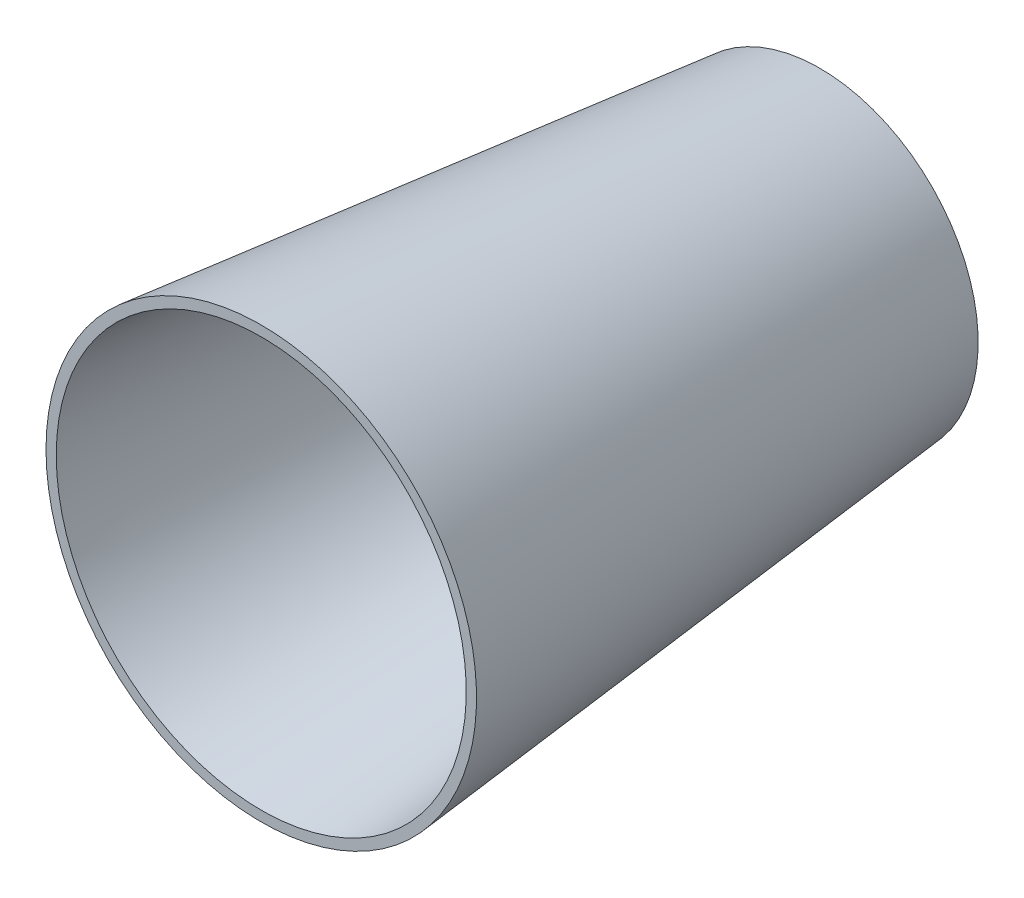
ISO-10303-21;
HEADER;
FILE_DESCRIPTION(('STEP AP214'),'2;1');
FILE_NAME('part.step','',(''),(''),'','','');
FILE_SCHEMA(('AUTOMOTIVE_DESIGN { 1 0 10303 214 1 1 1 1 }'));
ENDSEC;
DATA;
#1=APPLICATION_CONTEXT('core data for automotive mechanical design processes');
#2=APPLICATION_PROTOCOL_DEFINITION('international standard','automotive_design',2000,#1);
#3=PRODUCT_CONTEXT('',#1,'mechanical');
#4=PRODUCT('Part','Part','',(#3));
#5=PRODUCT_RELATED_PRODUCT_CATEGORY('part','',(#4));
#6=PRODUCT_DEFINITION_FORMATION('','',#4);
#7=PRODUCT_DEFINITION_CONTEXT('part definition',#1,'design');
#8=PRODUCT_DEFINITION('design','',#6,#7);
#9=PRODUCT_DEFINITION_SHAPE('','',#8);
#10=(LENGTH_UNIT() NAMED_UNIT(*) SI_UNIT(.MILLI.,.METRE.));
#11=(NAMED_UNIT(*) PLANE_ANGLE_UNIT() SI_UNIT($,.RADIAN.));
#12=(NAMED_UNIT(*) SI_UNIT($,.STERADIAN.) SOLID_ANGLE_UNIT());
#13=UNCERTAINTY_MEASURE_WITH_UNIT(LENGTH_MEASURE(1.E-05),#10,'distance_accuracy_value','');
#14=(GEOMETRIC_REPRESENTATION_CONTEXT(3) GLOBAL_UNCERTAINTY_ASSIGNED_CONTEXT((#13)) GLOBAL_UNIT_ASSIGNED_CONTEXT((#10,
#11,#12)) REPRESENTATION_CONTEXT('',''));
#15=CARTESIAN_POINT('',(0.,0.,0.));
#16=DIRECTION('',(0.,0.,1.));
#17=DIRECTION('',(1.,0.,0.));
#18=AXIS2_PLACEMENT_3D('',#15,#16,#17);
#19=CARTESIAN_POINT('',(0.,481.335355706457,34.121689050697));
#20=DIRECTION('',(0.,0.,1.));
#21=DIRECTION('',(1.,0.,0.));
#22=AXIS2_PLACEMENT_3D('',#19,#20,#21);
#23=PLANE('',#22);
#24=CARTESIAN_POINT('',(0.,481.335355706457,34.121689050697));
#25=DIRECTION('',(0.,0.,-1.));
#26=DIRECTION('',(-1.,0.,0.));
#27=AXIS2_PLACEMENT_3D('',#24,#25,#26);
#28=CIRCLE('',#27,30.);
#29=CARTESIAN_POINT('',(-30.,481.335355706457,34.121689050697));
#30=VERTEX_POINT('',#29);
#31=EDGE_CURVE('E64',#30,#30,#28,.T.);
#32=ORIENTED_EDGE('',*,*,#31,.T.);
#33=EDGE_LOOP('',(#32));
#34=FACE_BOUND('',#33,.T.);
#35=CARTESIAN_POINT('',(0.,481.335355706457,34.121689050697));
#36=DIRECTION('',(0.,0.,-1.));
#37=DIRECTION('',(-1.,0.,0.));
#38=AXIS2_PLACEMENT_3D('',#35,#36,#37);
#39=CIRCLE('',#38,31.5);
#40=CARTESIAN_POINT('',(-31.5,481.335355706457,34.121689050697));
#41=VERTEX_POINT('',#40);
#42=EDGE_CURVE('E54',#41,#41,#39,.T.);
#43=ORIENTED_EDGE('',*,*,#42,.F.);
#44=EDGE_LOOP('',(#43));
#45=FACE_BOUND('',#44,.T.);
#46=ADVANCED_FACE('F41',(#34,#45),#23,.T.);
#47=CARTESIAN_POINT('',(0.,481.335355706457,-46.1217266668383));
#48=DIRECTION('',(0.,0.,-1.));
#49=DIRECTION('',(-1.,0.,0.));
#50=AXIS2_PLACEMENT_3D('',#47,#48,#49);
#51=CONICAL_SURFACE('',#50,0.,0.108853111800816);
#52=CARTESIAN_POINT('',(0.,481.335355706457,-46.130710996536));
#53=DIRECTION('',(0.,0.,-1.));
#54=DIRECTION('',(-1.,0.,0.));
#55=AXIS2_PLACEMENT_3D('',#52,#53,#54);
#56=CIRCLE('',#55,0.000981853305108327);
#57=CARTESIAN_POINT('',(-0.000981853305107948,481.335355706457,-46.130710996536));
#58=VERTEX_POINT('',#57);
#59=EDGE_CURVE('E44',#58,#58,#56,.T.);
#60=CARTESIAN_POINT('',(0.,481.335355706457,-47.6217266668383));
#61=DIRECTION('',(0.,0.,-1.));
#62=DIRECTION('',(-1.,0.,0.));
#63=AXIS2_PLACEMENT_3D('',#60,#61,#62);
#64=CIRCLE('',#63,0.163927639258654);
#65=CARTESIAN_POINT('',(-0.163927639258654,481.335355706457,-47.6217266668383));
#66=VERTEX_POINT('',#65);
#67=EDGE_CURVE('E10',#66,#66,#64,.T.);
#68=CARTESIAN_POINT('',(-0.000981853305107948,481.335355706457,-46.130710996536));
#69=CARTESIAN_POINT('',(-0.00267920524212405,481.335355706457,-46.1462424097683));
#70=CARTESIAN_POINT('',(-0.00437655717914015,481.335355706457,-46.1617738230006));
#71=CARTESIAN_POINT('',(-0.00777126105317236,481.335355706457,-46.1928366494653));
#72=CARTESIAN_POINT('',(-0.00946861299018846,481.335355706457,-46.2083680626976));
#73=CARTESIAN_POINT('',(-0.0128633168642207,481.335355706457,-46.2394308891622));
#74=CARTESIAN_POINT('',(-0.0145606688012368,481.335355706457,-46.2549623023945));
#75=CARTESIAN_POINT('',(-0.017955372675269,481.335355706457,-46.2860251288592));
#76=CARTESIAN_POINT('',(-0.0196527246122851,481.335355706457,-46.3015565420915));
#77=CARTESIAN_POINT('',(-0.0230474284863173,481.335355706457,-46.3326193685561));
#78=CARTESIAN_POINT('',(-0.0247447804233334,481.335355706457,-46.3481507817884));
#79=CARTESIAN_POINT('',(-0.0281394842973656,481.335355706457,-46.379213608253));
#80=CARTESIAN_POINT('',(-0.0298368362343817,481.335355706457,-46.3947450214854));
#81=CARTESIAN_POINT('',(-0.0332315401084139,481.335355706457,-46.42580784795));
#82=CARTESIAN_POINT('',(-0.03492889204543,481.335355706457,-46.4413392611823));
#83=CARTESIAN_POINT('',(-0.0383235959194623,481.335355706457,-46.4724020876469));
#84=CARTESIAN_POINT('',(-0.0400209478564785,481.335355706457,-46.4879335008793));
#85=CARTESIAN_POINT('',(-0.0434156517305106,481.335355706457,-46.5189963273439));
#86=CARTESIAN_POINT('',(-0.0451130036675265,481.335355706457,-46.5345277405762));
#87=CARTESIAN_POINT('',(-0.0485077075415587,481.335355706457,-46.5655905670408));
#88=CARTESIAN_POINT('',(-0.0502050594785749,481.335355706457,-46.5811219802732));
#89=CARTESIAN_POINT('',(-0.0535997633526072,481.335355706457,-46.6121848067378));
#90=CARTESIAN_POINT('',(-0.0552971152896232,481.335355706457,-46.6277162199701));
#91=CARTESIAN_POINT('',(-0.0586918191636554,481.335355706457,-46.6587790464347));
#92=CARTESIAN_POINT('',(-0.0603891711006715,481.335355706457,-46.674310459667));
#93=CARTESIAN_POINT('',(-0.0637838749747038,481.335355706457,-46.7053732861317));
#94=CARTESIAN_POINT('',(-0.0654812269117199,481.335355706457,-46.720904699364));
#95=CARTESIAN_POINT('',(-0.068875930785752,481.335355706457,-46.7519675258286));
#96=CARTESIAN_POINT('',(-0.0705732827227681,481.335355706457,-46.7674989390609));
#97=CARTESIAN_POINT('',(-0.0739679865968004,481.335355706457,-46.7985617655256));
#98=CARTESIAN_POINT('',(-0.0756653385338166,481.335355706457,-46.8140931787579));
#99=CARTESIAN_POINT('',(-0.0790600424078488,481.335355706457,-46.8451560052225));
#100=CARTESIAN_POINT('',(-0.0807573943448647,481.335355706457,-46.8606874184548));
#101=CARTESIAN_POINT('',(-0.0841520982188968,481.335355706457,-46.8917502449195));
#102=CARTESIAN_POINT('',(-0.085849450155913,481.335355706457,-46.9072816581518));
#103=CARTESIAN_POINT('',(-0.0892441540299453,481.335355706457,-46.9383444846164));
#104=CARTESIAN_POINT('',(-0.0909415059669614,481.335355706457,-46.9538758978487));
#105=CARTESIAN_POINT('',(-0.0943362098409936,481.335355706457,-46.9849387243134));
#106=CARTESIAN_POINT('',(-0.0960335617780097,481.335355706457,-47.0004701375457));
#107=CARTESIAN_POINT('',(-0.0994282656520419,481.335355706457,-47.0315329640103));
#108=CARTESIAN_POINT('',(-0.101125617589058,481.335355706457,-47.0470643772426));
#109=CARTESIAN_POINT('',(-0.10452032146309,481.335355706457,-47.0781272037073));
#110=CARTESIAN_POINT('',(-0.106217673400106,481.335355706457,-47.0936586169396));
#111=CARTESIAN_POINT('',(-0.109612377274139,481.335355706457,-47.1247214434042));
#112=CARTESIAN_POINT('',(-0.111309729211155,481.335355706457,-47.1402528566365));
#113=CARTESIAN_POINT('',(-0.114704433085187,481.335355706457,-47.1713156831012));
#114=CARTESIAN_POINT('',(-0.116401785022203,481.335355706457,-47.1868470963335));
#115=CARTESIAN_POINT('',(-0.119796488896235,481.335355706457,-47.2179099227981));
#116=CARTESIAN_POINT('',(-0.121493840833251,481.335355706457,-47.2334413360304));
#117=CARTESIAN_POINT('',(-0.124888544707284,481.335355706457,-47.2645041624951));
#118=CARTESIAN_POINT('',(-0.126585896644299,481.335355706457,-47.2800355757274));
#119=CARTESIAN_POINT('',(-0.129980600518332,481.335355706457,-47.311098402192));
#120=CARTESIAN_POINT('',(-0.131677952455348,481.335355706457,-47.3266298154243));
#121=CARTESIAN_POINT('',(-0.13507265632938,481.335355706457,-47.357692641889));
#122=CARTESIAN_POINT('',(-0.136770008266396,481.335355706457,-47.3732240551213));
#123=CARTESIAN_POINT('',(-0.140164712140428,481.335355706457,-47.4042868815859));
#124=CARTESIAN_POINT('',(-0.141862064077444,481.335355706457,-47.4198182948182));
#125=CARTESIAN_POINT('',(-0.145256767951477,481.335355706457,-47.4508811212828));
#126=CARTESIAN_POINT('',(-0.146954119888493,481.335355706457,-47.4664125345152));
#127=CARTESIAN_POINT('',(-0.150348823762525,481.335355706457,-47.4974753609798));
#128=CARTESIAN_POINT('',(-0.152046175699541,481.335355706457,-47.5130067742121));
#129=CARTESIAN_POINT('',(-0.155440879573573,481.335355706457,-47.5440696006767));
#130=CARTESIAN_POINT('',(-0.157138231510589,481.335355706457,-47.5596010139091));
#131=CARTESIAN_POINT('',(-0.160532935384622,481.335355706457,-47.5906638403737));
#132=CARTESIAN_POINT('',(-0.162230287321638,481.335355706457,-47.606195253606));
#133=CARTESIAN_POINT('',(-0.163927639258654,481.335355706457,-47.6217266668383));
#134=B_SPLINE_CURVE_WITH_KNOTS('',3,(#68,#69,#70,#71,#72,#73,#74,#75,#76,#77,#78,#79,#80,#81,
#82,#83,#84,#85,#86,#87,#88,#89,#90,#91,#92,#93,#94,#95,#96,#97,#98,#99,#100,#101,#102,#103,
#104,#105,#106,#107,#108,#109,#110,#111,#112,#113,#114,#115,#116,#117,#118,#119,#120,#121,#122,
#123,#124,#125,#126,#127,#128,#129,#130,#131,#132,#133),.UNSPECIFIED.,.F.,.F.,(4,2,2,2,2,2,2,2,
2,2,2,2,2,2,2,2,2,2,2,2,2,2,2,2,2,2,2,2,2,2,2,2,4),(0.,0.0468716567375142,0.0937433134750285,
0.140614970212543,0.187486626950057,0.234358283687571,0.281229940425085,0.3281015971626,
0.374973253900114,0.421844910637635,0.468716567375149,0.515588224112664,0.562459880850178,
0.609331537587692,0.656203194325206,0.703074851062721,0.749946507800242,0.796818164537756,
0.84368982127527,0.890561478012785,0.937433134750299,0.984304791487813,1.03117644822533,
1.07804810496284,1.12491976170036,1.17179141843788,1.21866307517539,1.26553473191291,
1.31240638865042,1.35927804538793,1.40614970212545,1.45302135886296,1.49989301560048),.UNSPECIFIED.);
#135=EDGE_CURVE('BSEAM90',#58,#66,#134,.T.);
#136=ORIENTED_EDGE('',*,*,#59,.F.);
#137=ORIENTED_EDGE('',*,*,#67,.T.);
#138=ORIENTED_EDGE('',*,*,#135,.T.);
#139=ORIENTED_EDGE('',*,*,#135,.F.);
#140=EDGE_LOOP('',(#136,#138,#137,#139));
#141=FACE_BOUND('',#140,.T.);
#142=ADVANCED_FACE('F90',(#141),#51,.F.);
#143=CARTESIAN_POINT('',(0.,504.499283345716,-47.6217266668383));
#144=DIRECTION('',(0.,0.,-1.));
#145=DIRECTION('',(-1.,0.,0.));
#146=AXIS2_PLACEMENT_3D('',#143,#144,#145);
#147=PLANE('',#146);
#148=CARTESIAN_POINT('',(0.,481.335355706457,-47.6217266668383));
#149=DIRECTION('',(0.,0.,-1.));
#150=DIRECTION('',(-1.,0.,0.));
#151=AXIS2_PLACEMENT_3D('',#148,#149,#150);
#152=CIRCLE('',#151,23.1639276392587);
#153=CARTESIAN_POINT('',(-23.1639276392587,481.335355706457,-47.6217266668383));
#154=VERTEX_POINT('',#153);
#155=EDGE_CURVE('E49',#154,#154,#152,.T.);
#156=ORIENTED_EDGE('',*,*,#155,.T.);
#157=EDGE_LOOP('',(#156));
#158=FACE_BOUND('',#157,.T.);
#159=ORIENTED_EDGE('',*,*,#67,.F.);
#160=EDGE_LOOP('',(#159));
#161=FACE_BOUND('',#160,.T.);
#162=ADVANCED_FACE('F85',(#158,#161),#147,.T.);
#163=CARTESIAN_POINT('',(0.,481.335355706457,-47.6217266668383));
#164=DIRECTION('',(0.,0.,1.));
#165=DIRECTION('',(1.,0.,0.));
#166=AXIS2_PLACEMENT_3D('',#163,#164,#165);
#167=CONICAL_SURFACE('',#166,23.1639276392587,0.101627194666809);
#168=ORIENTED_EDGE('',*,*,#42,.T.);
#169=EDGE_LOOP('',(#168));
#170=FACE_BOUND('',#169,.T.);
#171=ORIENTED_EDGE('',*,*,#155,.F.);
#172=EDGE_LOOP('',(#171));
#173=FACE_BOUND('',#172,.T.);
#174=ADVANCED_FACE('F79',(#170,#173),#167,.T.);
#175=CARTESIAN_POINT('',(0.,503.17769536627,-46.130710996536));
#176=DIRECTION('',(0.,0.,-1.));
#177=DIRECTION('',(-1.,0.,0.));
#178=AXIS2_PLACEMENT_3D('',#175,#176,#177);
#179=PLANE('',#178);
#180=ORIENTED_EDGE('',*,*,#59,.T.);
#181=EDGE_LOOP('',(#180));
#182=FACE_BOUND('',#181,.T.);
#183=CARTESIAN_POINT('',(0.,481.335355706457,-46.130710996536));
#184=DIRECTION('',(0.,0.,-1.));
#185=DIRECTION('',(-1.,0.,0.));
#186=AXIS2_PLACEMENT_3D('',#183,#184,#185);
#187=CIRCLE('',#186,21.8423396598129);
#188=CARTESIAN_POINT('',(-21.8423396598129,481.335355706457,-46.130710996536));
#189=VERTEX_POINT('',#188);
#190=EDGE_CURVE('E60',#189,#189,#187,.T.);
#191=ORIENTED_EDGE('',*,*,#190,.F.);
#192=EDGE_LOOP('',(#191));
#193=FACE_BOUND('',#192,.T.);
#194=ADVANCED_FACE('F74',(#182,#193),#179,.F.);
#195=CARTESIAN_POINT('',(0.,481.335355706457,-46.130710996536));
#196=DIRECTION('',(0.,0.,1.));
#197=DIRECTION('',(1.,0.,0.));
#198=AXIS2_PLACEMENT_3D('',#195,#196,#197);
#199=CONICAL_SURFACE('',#198,21.8423396598129,0.101302095358974);
#200=ORIENTED_EDGE('',*,*,#31,.F.);
#201=EDGE_LOOP('',(#200));
#202=FACE_BOUND('',#201,.T.);
#203=ORIENTED_EDGE('',*,*,#190,.T.);
#204=EDGE_LOOP('',(#203));
#205=FACE_BOUND('',#204,.T.);
#206=ADVANCED_FACE('F71',(#202,#205),#199,.F.);
#207=CLOSED_SHELL('',(#46,#142,#162,#174,#194,#206));
#208=MANIFOLD_SOLID_BREP('B2',#207);
#209=ADVANCED_BREP_SHAPE_REPRESENTATION('',(#18,#208),#14);
#210=SHAPE_DEFINITION_REPRESENTATION(#9,#209);
ENDSEC;
END-ISO-10303-21;
